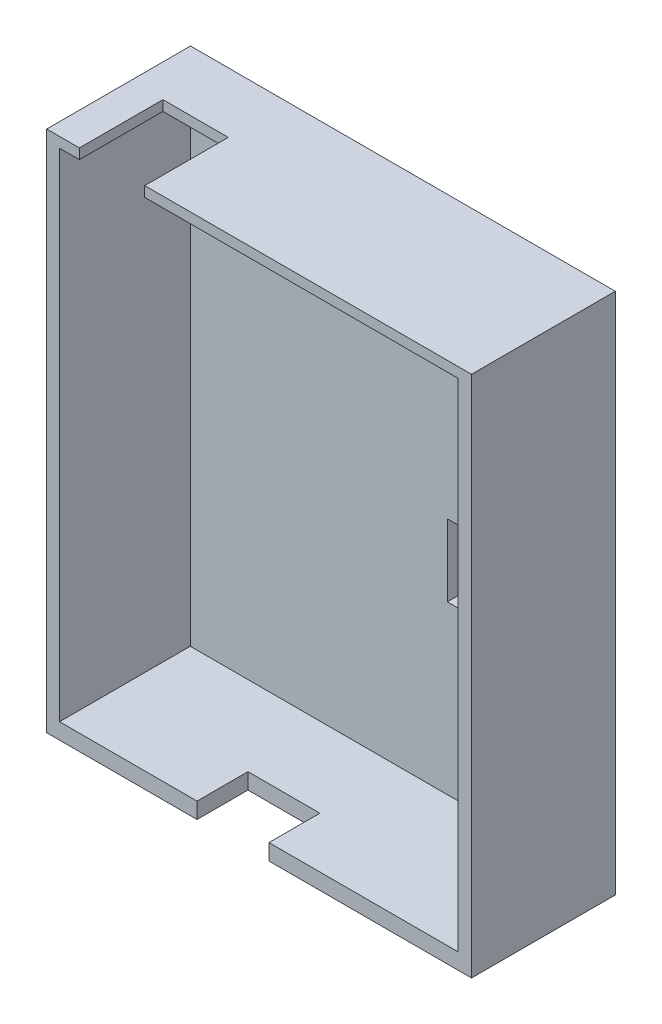
ISO-10303-21;
HEADER;
FILE_DESCRIPTION(('STEP AP214'),'2;1');
FILE_NAME('part.step','',(''),(''),'','','');
FILE_SCHEMA(('AUTOMOTIVE_DESIGN { 1 0 10303 214 1 1 1 1 }'));
ENDSEC;
DATA;
#1=APPLICATION_CONTEXT('core data for automotive mechanical design processes');
#2=APPLICATION_PROTOCOL_DEFINITION('international standard','automotive_design',2000,#1);
#3=PRODUCT_CONTEXT('',#1,'mechanical');
#4=PRODUCT('Part','Part','',(#3));
#5=PRODUCT_RELATED_PRODUCT_CATEGORY('part','',(#4));
#6=PRODUCT_DEFINITION_FORMATION('','',#4);
#7=PRODUCT_DEFINITION_CONTEXT('part definition',#1,'design');
#8=PRODUCT_DEFINITION('design','',#6,#7);
#9=PRODUCT_DEFINITION_SHAPE('','',#8);
#10=(LENGTH_UNIT() NAMED_UNIT(*) SI_UNIT(.MILLI.,.METRE.));
#11=(NAMED_UNIT(*) PLANE_ANGLE_UNIT() SI_UNIT($,.RADIAN.));
#12=(NAMED_UNIT(*) SI_UNIT($,.STERADIAN.) SOLID_ANGLE_UNIT());
#13=UNCERTAINTY_MEASURE_WITH_UNIT(LENGTH_MEASURE(1.E-05),#10,'distance_accuracy_value','');
#14=(GEOMETRIC_REPRESENTATION_CONTEXT(3) GLOBAL_UNCERTAINTY_ASSIGNED_CONTEXT((#13)) GLOBAL_UNIT_ASSIGNED_CONTEXT((#10,
#11,#12)) REPRESENTATION_CONTEXT('',''));
#15=CARTESIAN_POINT('',(0.,0.,0.));
#16=DIRECTION('',(0.,0.,1.));
#17=DIRECTION('',(1.,0.,0.));
#18=AXIS2_PLACEMENT_3D('',#15,#16,#17);
#19=CARTESIAN_POINT('',(0.,0.,22.));
#20=DIRECTION('',(0.,0.,1.));
#21=DIRECTION('',(1.,0.,0.));
#22=AXIS2_PLACEMENT_3D('',#19,#20,#21);
#23=PLANE('',#22);
#24=DIRECTION('',(0.,-1.,0.));
#25=VECTOR('',#24,1.);
#26=CARTESIAN_POINT('',(-19.2279657980381,0.,22.));
#27=LINE('',#26,#25);
#28=CARTESIAN_POINT('',(-19.2279657980381,48.8821138211382,22.));
#29=VERTEX_POINT('',#28);
#30=CARTESIAN_POINT('',(-19.2279657980381,47.3249881784567,22.));
#31=VERTEX_POINT('',#30);
#32=EDGE_CURVE('E211',#29,#31,#27,.T.);
#33=ORIENTED_EDGE('',*,*,#32,.F.);
#34=DIRECTION('',(-1.,0.,0.));
#35=VECTOR('',#34,1.);
#36=CARTESIAN_POINT('',(40.7704575376304,48.8821138211382,22.));
#37=LINE('',#36,#35);
#38=CARTESIAN_POINT('',(-24.2295424623696,48.8821138211382,22.));
#39=VERTEX_POINT('',#38);
#40=EDGE_CURVE('E302',#29,#39,#37,.T.);
#41=ORIENTED_EDGE('',*,*,#40,.T.);
#42=DIRECTION('',(0.,-1.,0.));
#43=VECTOR('',#42,1.);
#44=CARTESIAN_POINT('',(-24.2295424623696,48.8821138211382,22.));
#45=LINE('',#44,#43);
#46=CARTESIAN_POINT('',(-24.2295424623695,-31.1178861788618,22.));
#47=VERTEX_POINT('',#46);
#48=EDGE_CURVE('E301',#39,#47,#45,.T.);
#49=ORIENTED_EDGE('',*,*,#48,.T.);
#50=DIRECTION('',(1.,0.,0.));
#51=VECTOR('',#50,1.);
#52=CARTESIAN_POINT('',(-24.2295424623695,-31.1178861788618,22.));
#53=LINE('',#52,#51);
#54=CARTESIAN_POINT('',(-1.2306422306366,-31.1178861788618,22.));
#55=VERTEX_POINT('',#54);
#56=EDGE_CURVE('E305',#47,#55,#53,.T.);
#57=ORIENTED_EDGE('',*,*,#56,.T.);
#58=DIRECTION('',(0.,-1.,0.));
#59=VECTOR('',#58,1.);
#60=CARTESIAN_POINT('',(-1.2306422306366,0.,22.));
#61=LINE('',#60,#59);
#62=CARTESIAN_POINT('',(-1.23064223063661,-28.6750118215433,22.));
#63=VERTEX_POINT('',#62);
#64=EDGE_CURVE('E256',#63,#55,#61,.T.);
#65=ORIENTED_EDGE('',*,*,#64,.F.);
#66=DIRECTION('',(1.,0.,0.));
#67=VECTOR('',#66,1.);
#68=CARTESIAN_POINT('',(38.7351972370817,-28.6750118215433,22.));
#69=LINE('',#68,#67);
#70=CARTESIAN_POINT('',(-22.2648027629183,-28.6750118215433,22.));
#71=VERTEX_POINT('',#70);
#72=EDGE_CURVE('E279',#71,#63,#69,.T.);
#73=ORIENTED_EDGE('',*,*,#72,.F.);
#74=DIRECTION('',(0.,-1.,0.));
#75=VECTOR('',#74,1.);
#76=CARTESIAN_POINT('',(-22.2648027629183,-28.6750118215433,22.));
#77=LINE('',#76,#75);
#78=CARTESIAN_POINT('',(-22.2648027629183,47.3249881784567,22.));
#79=VERTEX_POINT('',#78);
#80=EDGE_CURVE('E261',#79,#71,#77,.T.);
#81=ORIENTED_EDGE('',*,*,#80,.F.);
#82=DIRECTION('',(-1.,0.,0.));
#83=VECTOR('',#82,1.);
#84=CARTESIAN_POINT('',(-22.2648027629183,47.3249881784567,22.));
#85=LINE('',#84,#83);
#86=EDGE_CURVE('E285',#31,#79,#85,.T.);
#87=ORIENTED_EDGE('',*,*,#86,.F.);
#88=EDGE_LOOP('',(#33,#41,#49,#57,#65,#73,#81,#87));
#89=FACE_BOUND('',#88,.T.);
#90=ADVANCED_FACE('F38',(#89),#23,.T.);
#91=CARTESIAN_POINT('',(40.7704575376304,48.8821138211382,22.));
#92=DIRECTION('',(0.,-1.,0.));
#93=DIRECTION('',(0.,0.,-1.));
#94=AXIS2_PLACEMENT_3D('',#91,#92,#93);
#95=PLANE('',#94);
#96=ORIENTED_EDGE('',*,*,#40,.F.);
#97=DIRECTION('',(0.,0.,1.));
#98=VECTOR('',#97,1.);
#99=CARTESIAN_POINT('',(-19.2279657980381,48.8821138211382,23.2177580308033));
#100=LINE('',#99,#98);
#101=CARTESIAN_POINT('',(-19.2279657980381,48.8821138211382,9.21775803080327));
#102=VERTEX_POINT('',#101);
#103=EDGE_CURVE('E203',#102,#29,#100,.T.);
#104=ORIENTED_EDGE('',*,*,#103,.F.);
#105=DIRECTION('',(-1.,0.,0.));
#106=VECTOR('',#105,1.);
#107=CARTESIAN_POINT('',(-19.2279657980381,48.8821138211382,9.21775803080327));
#108=LINE('',#107,#106);
#109=CARTESIAN_POINT('',(-9.22796579803812,48.8821138211382,9.21775803080327));
#110=VERTEX_POINT('',#109);
#111=EDGE_CURVE('E189',#110,#102,#108,.T.);
#112=ORIENTED_EDGE('',*,*,#111,.F.);
#113=DIRECTION('',(0.,0.,-1.));
#114=VECTOR('',#113,1.);
#115=CARTESIAN_POINT('',(-9.22796579803812,48.8821138211382,9.21775803080327));
#116=LINE('',#115,#114);
#117=CARTESIAN_POINT('',(-9.22796579803812,48.8821138211382,22.));
#118=VERTEX_POINT('',#117);
#119=EDGE_CURVE('E196',#118,#110,#116,.T.);
#120=ORIENTED_EDGE('',*,*,#119,.F.);
#121=CARTESIAN_POINT('',(40.7704575376304,48.8821138211382,22.));
#122=VERTEX_POINT('',#121);
#123=EDGE_CURVE('E299',#122,#118,#37,.T.);
#124=ORIENTED_EDGE('',*,*,#123,.F.);
#125=DIRECTION('',(0.,0.,-1.));
#126=VECTOR('',#125,1.);
#127=CARTESIAN_POINT('',(40.7704575376304,48.8821138211382,22.));
#128=LINE('',#127,#126);
#129=CARTESIAN_POINT('',(40.7704575376304,48.8821138211382,0.));
#130=VERTEX_POINT('',#129);
#131=EDGE_CURVE('E310',#122,#130,#128,.T.);
#132=ORIENTED_EDGE('',*,*,#131,.T.);
#133=DIRECTION('',(-1.,0.,0.));
#134=VECTOR('',#133,1.);
#135=CARTESIAN_POINT('',(40.7704575376304,48.8821138211382,0.));
#136=LINE('',#135,#134);
#137=CARTESIAN_POINT('',(-24.2295424623696,48.8821138211382,0.));
#138=VERTEX_POINT('',#137);
#139=EDGE_CURVE('E291',#130,#138,#136,.T.);
#140=ORIENTED_EDGE('',*,*,#139,.T.);
#141=DIRECTION('',(0.,0.,-1.));
#142=VECTOR('',#141,1.);
#143=CARTESIAN_POINT('',(-24.2295424623696,48.8821138211382,22.));
#144=LINE('',#143,#142);
#145=EDGE_CURVE('E327',#39,#138,#144,.T.);
#146=ORIENTED_EDGE('',*,*,#145,.F.);
#147=EDGE_LOOP('',(#96,#104,#112,#120,#124,#132,#140,#146));
#148=FACE_BOUND('',#147,.T.);
#149=ADVANCED_FACE('F40',(#148),#95,.F.);
#150=CARTESIAN_POINT('',(-24.2295424623696,48.8821138211382,22.));
#151=DIRECTION('',(1.,0.,0.));
#152=DIRECTION('',(0.,1.,0.));
#153=AXIS2_PLACEMENT_3D('',#150,#151,#152);
#154=PLANE('',#153);
#155=DIRECTION('',(0.,-1.,0.));
#156=VECTOR('',#155,1.);
#157=CARTESIAN_POINT('',(-24.2295424623696,48.8821138211382,0.));
#158=LINE('',#157,#156);
#159=CARTESIAN_POINT('',(-24.2295424623695,-31.1178861788618,0.));
#160=VERTEX_POINT('',#159);
#161=EDGE_CURVE('E313',#138,#160,#158,.T.);
#162=ORIENTED_EDGE('',*,*,#161,.T.);
#163=DIRECTION('',(0.,0.,-1.));
#164=VECTOR('',#163,1.);
#165=CARTESIAN_POINT('',(-24.2295424623695,-31.1178861788618,22.));
#166=LINE('',#165,#164);
#167=EDGE_CURVE('E324',#47,#160,#166,.T.);
#168=ORIENTED_EDGE('',*,*,#167,.F.);
#169=ORIENTED_EDGE('',*,*,#48,.F.);
#170=ORIENTED_EDGE('',*,*,#145,.T.);
#171=EDGE_LOOP('',(#162,#168,#169,#170));
#172=FACE_BOUND('',#171,.T.);
#173=ADVANCED_FACE('F371',(#172),#154,.F.);
#174=CARTESIAN_POINT('',(-24.2295424623695,-31.1178861788618,22.));
#175=DIRECTION('',(0.,1.,0.));
#176=DIRECTION('',(0.,0.,1.));
#177=AXIS2_PLACEMENT_3D('',#174,#175,#176);
#178=PLANE('',#177);
#179=CARTESIAN_POINT('',(9.76935776936339,-31.1178861788618,22.));
#180=VERTEX_POINT('',#179);
#181=CARTESIAN_POINT('',(40.7704575376304,-31.1178861788618,22.));
#182=VERTEX_POINT('',#181);
#183=EDGE_CURVE('E304',#180,#182,#53,.T.);
#184=ORIENTED_EDGE('',*,*,#183,.F.);
#185=DIRECTION('',(0.,0.,1.));
#186=VECTOR('',#185,1.);
#187=CARTESIAN_POINT('',(9.76935776936339,-31.1178861788618,22.7048923409227));
#188=LINE('',#187,#186);
#189=CARTESIAN_POINT('',(9.76935776936339,-31.1178861788618,14.2048923409227));
#190=VERTEX_POINT('',#189);
#191=EDGE_CURVE('E245',#190,#180,#188,.T.);
#192=ORIENTED_EDGE('',*,*,#191,.F.);
#193=DIRECTION('',(1.,0.,0.));
#194=VECTOR('',#193,1.);
#195=CARTESIAN_POINT('',(9.76935776936339,-31.1178861788618,14.2048923409227));
#196=LINE('',#195,#194);
#197=CARTESIAN_POINT('',(-1.23064223063659,-31.1178861788618,14.2048923409227));
#198=VERTEX_POINT('',#197);
#199=EDGE_CURVE('E250',#198,#190,#196,.T.);
#200=ORIENTED_EDGE('',*,*,#199,.F.);
#201=DIRECTION('',(0.,0.,-1.));
#202=VECTOR('',#201,1.);
#203=CARTESIAN_POINT('',(-1.23064223063659,-31.1178861788618,14.2048923409227));
#204=LINE('',#203,#202);
#205=EDGE_CURVE('E247',#55,#198,#204,.T.);
#206=ORIENTED_EDGE('',*,*,#205,.F.);
#207=ORIENTED_EDGE('',*,*,#56,.F.);
#208=ORIENTED_EDGE('',*,*,#167,.T.);
#209=DIRECTION('',(1.,0.,0.));
#210=VECTOR('',#209,1.);
#211=CARTESIAN_POINT('',(-24.2295424623695,-31.1178861788618,0.));
#212=LINE('',#211,#210);
#213=CARTESIAN_POINT('',(40.7704575376304,-31.1178861788618,0.));
#214=VERTEX_POINT('',#213);
#215=EDGE_CURVE('E315',#160,#214,#212,.T.);
#216=ORIENTED_EDGE('',*,*,#215,.T.);
#217=DIRECTION('',(0.,0.,-1.));
#218=VECTOR('',#217,1.);
#219=CARTESIAN_POINT('',(40.7704575376304,-31.1178861788618,22.));
#220=LINE('',#219,#218);
#221=EDGE_CURVE('E321',#182,#214,#220,.T.);
#222=ORIENTED_EDGE('',*,*,#221,.F.);
#223=EDGE_LOOP('',(#184,#192,#200,#206,#207,#208,#216,#222));
#224=FACE_BOUND('',#223,.T.);
#225=ADVANCED_FACE('F404',(#224),#178,.F.);
#226=CARTESIAN_POINT('',(40.7704575376304,-31.1178861788618,22.));
#227=DIRECTION('',(-1.,0.,0.));
#228=DIRECTION('',(0.,-1.,0.));
#229=AXIS2_PLACEMENT_3D('',#226,#227,#228);
#230=PLANE('',#229);
#231=DIRECTION('',(0.,1.,0.));
#232=VECTOR('',#231,1.);
#233=CARTESIAN_POINT('',(40.7704575376304,-31.1178861788618,0.));
#234=LINE('',#233,#232);
#235=EDGE_CURVE('E317',#214,#130,#234,.T.);
#236=ORIENTED_EDGE('',*,*,#235,.T.);
#237=ORIENTED_EDGE('',*,*,#131,.F.);
#238=DIRECTION('',(0.,1.,0.));
#239=VECTOR('',#238,1.);
#240=CARTESIAN_POINT('',(40.7704575376304,-31.1178861788618,22.));
#241=LINE('',#240,#239);
#242=EDGE_CURVE('E308',#182,#122,#241,.T.);
#243=ORIENTED_EDGE('',*,*,#242,.F.);
#244=ORIENTED_EDGE('',*,*,#221,.T.);
#245=EDGE_LOOP('',(#236,#237,#243,#244));
#246=FACE_BOUND('',#245,.T.);
#247=ADVANCED_FACE('F396',(#246),#230,.F.);
#248=DIRECTION('',(0.,1.,0.));
#249=VECTOR('',#248,1.);
#250=CARTESIAN_POINT('',(-9.22796579803812,0.,22.));
#251=LINE('',#250,#249);
#252=CARTESIAN_POINT('',(-9.22796579803812,47.3249881784567,22.));
#253=VERTEX_POINT('',#252);
#254=EDGE_CURVE('E199',#253,#118,#251,.T.);
#255=ORIENTED_EDGE('',*,*,#254,.F.);
#256=CARTESIAN_POINT('',(38.7351972370817,47.3249881784567,22.));
#257=VERTEX_POINT('',#256);
#258=EDGE_CURVE('E266',#257,#253,#85,.T.);
#259=ORIENTED_EDGE('',*,*,#258,.F.);
#260=DIRECTION('',(0.,1.,0.));
#261=VECTOR('',#260,1.);
#262=CARTESIAN_POINT('',(38.7351972370817,47.3249881784567,22.));
#263=LINE('',#262,#261);
#264=CARTESIAN_POINT('',(38.7351972370817,-28.6750118215433,22.));
#265=VERTEX_POINT('',#264);
#266=EDGE_CURVE('E282',#265,#257,#263,.T.);
#267=ORIENTED_EDGE('',*,*,#266,.F.);
#268=CARTESIAN_POINT('',(9.76935776936339,-28.6750118215433,22.));
#269=VERTEX_POINT('',#268);
#270=EDGE_CURVE('E278',#269,#265,#69,.T.);
#271=ORIENTED_EDGE('',*,*,#270,.F.);
#272=DIRECTION('',(0.,1.,0.));
#273=VECTOR('',#272,1.);
#274=CARTESIAN_POINT('',(9.76935776936339,0.,22.));
#275=LINE('',#274,#273);
#276=EDGE_CURVE('E259',#180,#269,#275,.T.);
#277=ORIENTED_EDGE('',*,*,#276,.F.);
#278=ORIENTED_EDGE('',*,*,#183,.T.);
#279=ORIENTED_EDGE('',*,*,#242,.T.);
#280=ORIENTED_EDGE('',*,*,#123,.T.);
#281=EDGE_LOOP('',(#255,#259,#267,#271,#277,#278,#279,#280));
#282=FACE_BOUND('',#281,.T.);
#283=ADVANCED_FACE('F357',(#282),#23,.T.);
#284=CARTESIAN_POINT('',(0.,0.,0.));
#285=DIRECTION('',(0.,0.,1.));
#286=DIRECTION('',(1.,0.,0.));
#287=AXIS2_PLACEMENT_3D('',#284,#285,#286);
#288=PLANE('',#287);
#289=DIRECTION('',(-1.,0.,0.));
#290=VECTOR('',#289,1.);
#291=CARTESIAN_POINT('',(17.073968875299,-3.12058119178454,0.));
#292=LINE('',#291,#290);
#293=CARTESIAN_POINT('',(40.073968875299,-3.12058119178454,0.));
#294=VERTEX_POINT('',#293);
#295=CARTESIAN_POINT('',(17.073968875299,-3.12058119178454,0.));
#296=VERTEX_POINT('',#295);
#297=EDGE_CURVE('E224',#294,#296,#292,.T.);
#298=ORIENTED_EDGE('',*,*,#297,.F.);
#299=DIRECTION('',(0.,-1.,0.));
#300=VECTOR('',#299,1.);
#301=CARTESIAN_POINT('',(40.073968875299,-3.12058119178454,0.));
#302=LINE('',#301,#300);
#303=CARTESIAN_POINT('',(40.073968875299,7.87941880821546,0.));
#304=VERTEX_POINT('',#303);
#305=EDGE_CURVE('E61',#304,#294,#302,.T.);
#306=ORIENTED_EDGE('',*,*,#305,.F.);
#307=DIRECTION('',(1.,0.,0.));
#308=VECTOR('',#307,1.);
#309=CARTESIAN_POINT('',(40.073968875299,7.87941880821546,0.));
#310=LINE('',#309,#308);
#311=CARTESIAN_POINT('',(17.073968875299,7.87941880821546,0.));
#312=VERTEX_POINT('',#311);
#313=EDGE_CURVE('E217',#312,#304,#310,.T.);
#314=ORIENTED_EDGE('',*,*,#313,.F.);
#315=DIRECTION('',(0.,1.,0.));
#316=VECTOR('',#315,1.);
#317=CARTESIAN_POINT('',(17.073968875299,7.87941880821546,0.));
#318=LINE('',#317,#316);
#319=EDGE_CURVE('E227',#296,#312,#318,.T.);
#320=ORIENTED_EDGE('',*,*,#319,.F.);
#321=EDGE_LOOP('',(#298,#306,#314,#320));
#322=FACE_BOUND('',#321,.T.);
#323=ORIENTED_EDGE('',*,*,#139,.F.);
#324=ORIENTED_EDGE('',*,*,#235,.F.);
#325=ORIENTED_EDGE('',*,*,#215,.F.);
#326=ORIENTED_EDGE('',*,*,#161,.F.);
#327=EDGE_LOOP('',(#323,#324,#325,#326));
#328=FACE_BOUND('',#327,.T.);
#329=ADVANCED_FACE('F366',(#322,#328),#288,.F.);
#330=CARTESIAN_POINT('',(-22.2648027629183,-28.6750118215433,2.));
#331=DIRECTION('',(-1.,0.,0.));
#332=DIRECTION('',(0.,0.,1.));
#333=AXIS2_PLACEMENT_3D('',#330,#331,#332);
#334=PLANE('',#333);
#335=ORIENTED_EDGE('',*,*,#80,.T.);
#336=DIRECTION('',(0.,0.,1.));
#337=VECTOR('',#336,1.);
#338=CARTESIAN_POINT('',(-22.2648027629183,-28.6750118215433,2.));
#339=LINE('',#338,#337);
#340=CARTESIAN_POINT('',(-22.2648027629183,-28.6750118215433,2.));
#341=VERTEX_POINT('',#340);
#342=EDGE_CURVE('E276',#341,#71,#339,.T.);
#343=ORIENTED_EDGE('',*,*,#342,.F.);
#344=DIRECTION('',(0.,-1.,0.));
#345=VECTOR('',#344,1.);
#346=CARTESIAN_POINT('',(-22.2648027629183,-28.6750118215433,2.));
#347=LINE('',#346,#345);
#348=CARTESIAN_POINT('',(-22.2648027629183,47.3249881784567,2.));
#349=VERTEX_POINT('',#348);
#350=EDGE_CURVE('E262',#349,#341,#347,.T.);
#351=ORIENTED_EDGE('',*,*,#350,.F.);
#352=DIRECTION('',(0.,0.,1.));
#353=VECTOR('',#352,1.);
#354=CARTESIAN_POINT('',(-22.2648027629183,47.3249881784567,2.));
#355=LINE('',#354,#353);
#356=EDGE_CURVE('E288',#349,#79,#355,.T.);
#357=ORIENTED_EDGE('',*,*,#356,.T.);
#358=EDGE_LOOP('',(#335,#343,#351,#357));
#359=FACE_BOUND('',#358,.T.);
#360=ADVANCED_FACE('F401',(#359),#334,.F.);
#361=CARTESIAN_POINT('',(-22.2648027629183,47.3249881784567,2.));
#362=DIRECTION('',(0.,1.,0.));
#363=DIRECTION('',(-1.,0.,0.));
#364=AXIS2_PLACEMENT_3D('',#361,#362,#363);
#365=PLANE('',#364);
#366=DIRECTION('',(-1.,0.,0.));
#367=VECTOR('',#366,1.);
#368=CARTESIAN_POINT('',(-22.2648027629183,47.3249881784567,9.21775803080327));
#369=LINE('',#368,#367);
#370=CARTESIAN_POINT('',(-9.22796579803812,47.3249881784567,9.21775803080327));
#371=VERTEX_POINT('',#370);
#372=CARTESIAN_POINT('',(-19.2279657980381,47.3249881784567,9.21775803080327));
#373=VERTEX_POINT('',#372);
#374=EDGE_CURVE('E46',#371,#373,#369,.T.);
#375=ORIENTED_EDGE('',*,*,#374,.T.);
#376=DIRECTION('',(0.,0.,1.));
#377=VECTOR('',#376,1.);
#378=CARTESIAN_POINT('',(-19.2279657980381,47.3249881784567,2.));
#379=LINE('',#378,#377);
#380=EDGE_CURVE('E11',#373,#31,#379,.T.);
#381=ORIENTED_EDGE('',*,*,#380,.T.);
#382=ORIENTED_EDGE('',*,*,#86,.T.);
#383=ORIENTED_EDGE('',*,*,#356,.F.);
#384=DIRECTION('',(-1.,0.,0.));
#385=VECTOR('',#384,1.);
#386=CARTESIAN_POINT('',(-22.2648027629183,47.3249881784567,2.));
#387=LINE('',#386,#385);
#388=CARTESIAN_POINT('',(38.7351972370817,47.3249881784567,2.));
#389=VERTEX_POINT('',#388);
#390=EDGE_CURVE('E273',#389,#349,#387,.T.);
#391=ORIENTED_EDGE('',*,*,#390,.F.);
#392=DIRECTION('',(0.,0.,1.));
#393=VECTOR('',#392,1.);
#394=CARTESIAN_POINT('',(38.7351972370817,47.3249881784567,2.));
#395=LINE('',#394,#393);
#396=EDGE_CURVE('E292',#389,#257,#395,.T.);
#397=ORIENTED_EDGE('',*,*,#396,.T.);
#398=ORIENTED_EDGE('',*,*,#258,.T.);
#399=DIRECTION('',(0.,0.,-1.));
#400=VECTOR('',#399,1.);
#401=CARTESIAN_POINT('',(-9.22796579803812,47.3249881784567,2.));
#402=LINE('',#401,#400);
#403=EDGE_CURVE('E351',#253,#371,#402,.T.);
#404=ORIENTED_EDGE('',*,*,#403,.T.);
#405=EDGE_LOOP('',(#375,#381,#382,#383,#391,#397,#398,#404));
#406=FACE_BOUND('',#405,.T.);
#407=ADVANCED_FACE('F353',(#406),#365,.F.);
#408=CARTESIAN_POINT('',(38.7351972370817,47.3249881784567,2.));
#409=DIRECTION('',(1.,0.,0.));
#410=DIRECTION('',(0.,1.,0.));
#411=AXIS2_PLACEMENT_3D('',#408,#409,#410);
#412=PLANE('',#411);
#413=DIRECTION('',(0.,1.,0.));
#414=VECTOR('',#413,1.);
#415=CARTESIAN_POINT('',(38.7351972370817,47.3249881784567,2.));
#416=LINE('',#415,#414);
#417=CARTESIAN_POINT('',(38.7351972370817,7.87941880821546,2.));
#418=VERTEX_POINT('',#417);
#419=EDGE_CURVE('E269',#418,#389,#416,.T.);
#420=ORIENTED_EDGE('',*,*,#419,.F.);
#421=DIRECTION('',(0.,0.,1.));
#422=VECTOR('',#421,1.);
#423=CARTESIAN_POINT('',(38.7351972370817,7.87941880821545,2.));
#424=LINE('',#423,#422);
#425=CARTESIAN_POINT('',(38.7351972370817,7.87941880821546,3.));
#426=VERTEX_POINT('',#425);
#427=EDGE_CURVE('E242',#418,#426,#424,.T.);
#428=ORIENTED_EDGE('',*,*,#427,.T.);
#429=DIRECTION('',(0.,-1.,0.));
#430=VECTOR('',#429,1.);
#431=CARTESIAN_POINT('',(38.7351972370817,47.3249881784567,3.));
#432=LINE('',#431,#430);
#433=CARTESIAN_POINT('',(38.7351972370817,-3.12058119178454,3.));
#434=VERTEX_POINT('',#433);
#435=EDGE_CURVE('E348',#426,#434,#432,.T.);
#436=ORIENTED_EDGE('',*,*,#435,.T.);
#437=DIRECTION('',(0.,0.,-1.));
#438=VECTOR('',#437,1.);
#439=CARTESIAN_POINT('',(38.7351972370817,-3.12058119178454,2.));
#440=LINE('',#439,#438);
#441=CARTESIAN_POINT('',(38.7351972370817,-3.12058119178454,2.));
#442=VERTEX_POINT('',#441);
#443=EDGE_CURVE('E234',#434,#442,#440,.T.);
#444=ORIENTED_EDGE('',*,*,#443,.T.);
#445=CARTESIAN_POINT('',(38.7351972370817,-28.6750118215433,2.));
#446=VERTEX_POINT('',#445);
#447=EDGE_CURVE('E270',#446,#442,#416,.T.);
#448=ORIENTED_EDGE('',*,*,#447,.F.);
#449=DIRECTION('',(0.,0.,1.));
#450=VECTOR('',#449,1.);
#451=CARTESIAN_POINT('',(38.7351972370817,-28.6750118215433,2.));
#452=LINE('',#451,#450);
#453=EDGE_CURVE('E294',#446,#265,#452,.T.);
#454=ORIENTED_EDGE('',*,*,#453,.T.);
#455=ORIENTED_EDGE('',*,*,#266,.T.);
#456=ORIENTED_EDGE('',*,*,#396,.F.);
#457=EDGE_LOOP('',(#420,#428,#436,#444,#448,#454,#455,#456));
#458=FACE_BOUND('',#457,.T.);
#459=ADVANCED_FACE('F437',(#458),#412,.F.);
#460=CARTESIAN_POINT('',(38.7351972370817,-28.6750118215433,2.));
#461=DIRECTION('',(0.,-1.,0.));
#462=DIRECTION('',(1.,0.,0.));
#463=AXIS2_PLACEMENT_3D('',#460,#461,#462);
#464=PLANE('',#463);
#465=DIRECTION('',(1.,0.,0.));
#466=VECTOR('',#465,1.);
#467=CARTESIAN_POINT('',(38.7351972370817,-28.6750118215433,14.2048923409227));
#468=LINE('',#467,#466);
#469=CARTESIAN_POINT('',(-1.2306422306366,-28.6750118215433,14.2048923409227));
#470=VERTEX_POINT('',#469);
#471=CARTESIAN_POINT('',(9.76935776936339,-28.6750118215433,14.2048923409227));
#472=VERTEX_POINT('',#471);
#473=EDGE_CURVE('E333',#470,#472,#468,.T.);
#474=ORIENTED_EDGE('',*,*,#473,.T.);
#475=DIRECTION('',(0.,0.,1.));
#476=VECTOR('',#475,1.);
#477=CARTESIAN_POINT('',(9.76935776936339,-28.6750118215433,2.));
#478=LINE('',#477,#476);
#479=EDGE_CURVE('E336',#472,#269,#478,.T.);
#480=ORIENTED_EDGE('',*,*,#479,.T.);
#481=ORIENTED_EDGE('',*,*,#270,.T.);
#482=ORIENTED_EDGE('',*,*,#453,.F.);
#483=DIRECTION('',(1.,0.,0.));
#484=VECTOR('',#483,1.);
#485=CARTESIAN_POINT('',(38.7351972370817,-28.6750118215433,2.));
#486=LINE('',#485,#484);
#487=EDGE_CURVE('E265',#341,#446,#486,.T.);
#488=ORIENTED_EDGE('',*,*,#487,.F.);
#489=ORIENTED_EDGE('',*,*,#342,.T.);
#490=ORIENTED_EDGE('',*,*,#72,.T.);
#491=DIRECTION('',(0.,0.,-1.));
#492=VECTOR('',#491,1.);
#493=CARTESIAN_POINT('',(-1.23064223063659,-28.6750118215433,1.99999999999997));
#494=LINE('',#493,#492);
#495=EDGE_CURVE('E330',#63,#470,#494,.T.);
#496=ORIENTED_EDGE('',*,*,#495,.T.);
#497=EDGE_LOOP('',(#474,#480,#481,#482,#488,#489,#490,#496));
#498=FACE_BOUND('',#497,.T.);
#499=ADVANCED_FACE('F431',(#498),#464,.F.);
#500=CARTESIAN_POINT('',(0.,0.,2.));
#501=DIRECTION('',(0.,0.,-1.));
#502=DIRECTION('',(-1.,0.,0.));
#503=AXIS2_PLACEMENT_3D('',#500,#501,#502);
#504=PLANE('',#503);
#505=DIRECTION('',(0.,1.,0.));
#506=VECTOR('',#505,1.);
#507=CARTESIAN_POINT('',(17.073968875299,0.,2.));
#508=LINE('',#507,#506);
#509=CARTESIAN_POINT('',(17.073968875299,-3.12058119178454,2.));
#510=VERTEX_POINT('',#509);
#511=CARTESIAN_POINT('',(17.073968875299,7.87941880821546,2.));
#512=VERTEX_POINT('',#511);
#513=EDGE_CURVE('E342',#510,#512,#508,.T.);
#514=ORIENTED_EDGE('',*,*,#513,.T.);
#515=DIRECTION('',(1.,0.,0.));
#516=VECTOR('',#515,1.);
#517=CARTESIAN_POINT('',(0.,7.87941880821546,2.));
#518=LINE('',#517,#516);
#519=EDGE_CURVE('E345',#512,#418,#518,.T.);
#520=ORIENTED_EDGE('',*,*,#519,.T.);
#521=ORIENTED_EDGE('',*,*,#419,.T.);
#522=ORIENTED_EDGE('',*,*,#390,.T.);
#523=ORIENTED_EDGE('',*,*,#350,.T.);
#524=ORIENTED_EDGE('',*,*,#487,.T.);
#525=ORIENTED_EDGE('',*,*,#447,.T.);
#526=DIRECTION('',(-1.,0.,0.));
#527=VECTOR('',#526,1.);
#528=CARTESIAN_POINT('',(0.,-3.12058119178454,2.));
#529=LINE('',#528,#527);
#530=EDGE_CURVE('E339',#442,#510,#529,.T.);
#531=ORIENTED_EDGE('',*,*,#530,.T.);
#532=EDGE_LOOP('',(#514,#520,#521,#522,#523,#524,#525,#531));
#533=FACE_BOUND('',#532,.T.);
#534=ADVANCED_FACE('F436',(#533),#504,.F.);
#535=CARTESIAN_POINT('',(9.76935776936339,-28.1178861788618,14.2048923409227));
#536=DIRECTION('',(0.,0.,-1.));
#537=DIRECTION('',(-1.,0.,0.));
#538=AXIS2_PLACEMENT_3D('',#535,#536,#537);
#539=PLANE('',#538);
#540=DIRECTION('',(0.,-1.,0.));
#541=VECTOR('',#540,1.);
#542=CARTESIAN_POINT('',(-1.23064223063659,-28.1178861788618,14.2048923409227));
#543=LINE('',#542,#541);
#544=EDGE_CURVE('E253',#470,#198,#543,.T.);
#545=ORIENTED_EDGE('',*,*,#544,.T.);
#546=ORIENTED_EDGE('',*,*,#199,.T.);
#547=DIRECTION('',(0.,-1.,0.));
#548=VECTOR('',#547,1.);
#549=CARTESIAN_POINT('',(9.76935776936339,-28.1178861788618,14.2048923409227));
#550=LINE('',#549,#548);
#551=EDGE_CURVE('E254',#472,#190,#550,.T.);
#552=ORIENTED_EDGE('',*,*,#551,.F.);
#553=ORIENTED_EDGE('',*,*,#473,.F.);
#554=EDGE_LOOP('',(#545,#546,#552,#553));
#555=FACE_BOUND('',#554,.T.);
#556=ADVANCED_FACE('F447',(#555),#539,.F.);
#557=CARTESIAN_POINT('',(9.76935776936339,-28.1178861788618,22.7048923409227));
#558=DIRECTION('',(1.,0.,0.));
#559=DIRECTION('',(0.,0.,-1.));
#560=AXIS2_PLACEMENT_3D('',#557,#558,#559);
#561=PLANE('',#560);
#562=ORIENTED_EDGE('',*,*,#276,.T.);
#563=ORIENTED_EDGE('',*,*,#479,.F.);
#564=ORIENTED_EDGE('',*,*,#551,.T.);
#565=ORIENTED_EDGE('',*,*,#191,.T.);
#566=EDGE_LOOP('',(#562,#563,#564,#565));
#567=FACE_BOUND('',#566,.T.);
#568=ADVANCED_FACE('F452',(#567),#561,.F.);
#569=CARTESIAN_POINT('',(-1.23064223063659,-28.1178861788618,14.2048923409227));
#570=DIRECTION('',(-1.,0.,0.));
#571=DIRECTION('',(0.,0.,1.));
#572=AXIS2_PLACEMENT_3D('',#569,#570,#571);
#573=PLANE('',#572);
#574=ORIENTED_EDGE('',*,*,#64,.T.);
#575=ORIENTED_EDGE('',*,*,#205,.T.);
#576=ORIENTED_EDGE('',*,*,#544,.F.);
#577=ORIENTED_EDGE('',*,*,#495,.F.);
#578=EDGE_LOOP('',(#574,#575,#576,#577));
#579=FACE_BOUND('',#578,.T.);
#580=ADVANCED_FACE('F462',(#579),#573,.F.);
#581=CARTESIAN_POINT('',(0.,0.,3.));
#582=DIRECTION('',(0.,0.,1.));
#583=DIRECTION('',(1.,0.,0.));
#584=AXIS2_PLACEMENT_3D('',#581,#582,#583);
#585=PLANE('',#584);
#586=DIRECTION('',(1.,0.,0.));
#587=VECTOR('',#586,1.);
#588=CARTESIAN_POINT('',(40.073968875299,7.87941880821546,3.));
#589=LINE('',#588,#587);
#590=CARTESIAN_POINT('',(40.073968875299,7.87941880821546,3.));
#591=VERTEX_POINT('',#590);
#592=EDGE_CURVE('E220',#426,#591,#589,.T.);
#593=ORIENTED_EDGE('',*,*,#592,.T.);
#594=DIRECTION('',(0.,-1.,0.));
#595=VECTOR('',#594,1.);
#596=CARTESIAN_POINT('',(40.073968875299,-3.12058119178454,3.));
#597=LINE('',#596,#595);
#598=CARTESIAN_POINT('',(40.073968875299,-3.12058119178454,3.));
#599=VERTEX_POINT('',#598);
#600=EDGE_CURVE('E213',#591,#599,#597,.T.);
#601=ORIENTED_EDGE('',*,*,#600,.T.);
#602=DIRECTION('',(-1.,0.,0.));
#603=VECTOR('',#602,1.);
#604=CARTESIAN_POINT('',(17.073968875299,-3.12058119178454,3.));
#605=LINE('',#604,#603);
#606=EDGE_CURVE('E216',#599,#434,#605,.T.);
#607=ORIENTED_EDGE('',*,*,#606,.T.);
#608=ORIENTED_EDGE('',*,*,#435,.F.);
#609=EDGE_LOOP('',(#593,#601,#607,#608));
#610=FACE_BOUND('',#609,.T.);
#611=ADVANCED_FACE('F472',(#610),#585,.F.);
#612=CARTESIAN_POINT('',(40.073968875299,7.87941880821546,3.));
#613=DIRECTION('',(0.,1.,0.));
#614=DIRECTION('',(-1.,0.,0.));
#615=AXIS2_PLACEMENT_3D('',#612,#613,#614);
#616=PLANE('',#615);
#617=ORIENTED_EDGE('',*,*,#519,.F.);
#618=DIRECTION('',(0.,0.,-1.));
#619=VECTOR('',#618,1.);
#620=CARTESIAN_POINT('',(17.073968875299,7.87941880821546,3.));
#621=LINE('',#620,#619);
#622=EDGE_CURVE('E235',#512,#312,#621,.T.);
#623=ORIENTED_EDGE('',*,*,#622,.T.);
#624=ORIENTED_EDGE('',*,*,#313,.T.);
#625=DIRECTION('',(0.,0.,-1.));
#626=VECTOR('',#625,1.);
#627=CARTESIAN_POINT('',(40.073968875299,7.87941880821546,3.));
#628=LINE('',#627,#626);
#629=EDGE_CURVE('E232',#591,#304,#628,.T.);
#630=ORIENTED_EDGE('',*,*,#629,.F.);
#631=ORIENTED_EDGE('',*,*,#592,.F.);
#632=ORIENTED_EDGE('',*,*,#427,.F.);
#633=EDGE_LOOP('',(#617,#623,#624,#630,#631,#632));
#634=FACE_BOUND('',#633,.T.);
#635=ADVANCED_FACE('F505',(#634),#616,.F.);
#636=CARTESIAN_POINT('',(17.073968875299,7.87941880821546,3.));
#637=DIRECTION('',(-1.,0.,0.));
#638=DIRECTION('',(0.,0.,1.));
#639=AXIS2_PLACEMENT_3D('',#636,#637,#638);
#640=PLANE('',#639);
#641=DIRECTION('',(0.,0.,-1.));
#642=VECTOR('',#641,1.);
#643=CARTESIAN_POINT('',(17.073968875299,-3.12058119178454,3.));
#644=LINE('',#643,#642);
#645=EDGE_CURVE('E237',#510,#296,#644,.T.);
#646=ORIENTED_EDGE('',*,*,#645,.T.);
#647=ORIENTED_EDGE('',*,*,#319,.T.);
#648=ORIENTED_EDGE('',*,*,#622,.F.);
#649=ORIENTED_EDGE('',*,*,#513,.F.);
#650=EDGE_LOOP('',(#646,#647,#648,#649));
#651=FACE_BOUND('',#650,.T.);
#652=ADVANCED_FACE('F514',(#651),#640,.F.);
#653=CARTESIAN_POINT('',(17.073968875299,-3.12058119178454,3.));
#654=DIRECTION('',(0.,-1.,0.));
#655=DIRECTION('',(1.,0.,0.));
#656=AXIS2_PLACEMENT_3D('',#653,#654,#655);
#657=PLANE('',#656);
#658=ORIENTED_EDGE('',*,*,#606,.F.);
#659=DIRECTION('',(0.,0.,-1.));
#660=VECTOR('',#659,1.);
#661=CARTESIAN_POINT('',(40.073968875299,-3.12058119178454,3.));
#662=LINE('',#661,#660);
#663=EDGE_CURVE('E222',#599,#294,#662,.T.);
#664=ORIENTED_EDGE('',*,*,#663,.T.);
#665=ORIENTED_EDGE('',*,*,#297,.T.);
#666=ORIENTED_EDGE('',*,*,#645,.F.);
#667=ORIENTED_EDGE('',*,*,#530,.F.);
#668=ORIENTED_EDGE('',*,*,#443,.F.);
#669=EDGE_LOOP('',(#658,#664,#665,#666,#667,#668));
#670=FACE_BOUND('',#669,.T.);
#671=ADVANCED_FACE('F524',(#670),#657,.F.);
#672=CARTESIAN_POINT('',(40.073968875299,-3.12058119178454,3.));
#673=DIRECTION('',(1.,0.,0.));
#674=DIRECTION('',(0.,0.,-1.));
#675=AXIS2_PLACEMENT_3D('',#672,#673,#674);
#676=PLANE('',#675);
#677=ORIENTED_EDGE('',*,*,#305,.T.);
#678=ORIENTED_EDGE('',*,*,#663,.F.);
#679=ORIENTED_EDGE('',*,*,#600,.F.);
#680=ORIENTED_EDGE('',*,*,#629,.T.);
#681=EDGE_LOOP('',(#677,#678,#679,#680));
#682=FACE_BOUND('',#681,.T.);
#683=ADVANCED_FACE('F384',(#682),#676,.F.);
#684=CARTESIAN_POINT('',(-19.2279657980381,45.8821138211382,9.21775803080327));
#685=DIRECTION('',(0.,0.,-1.));
#686=DIRECTION('',(-1.,0.,0.));
#687=AXIS2_PLACEMENT_3D('',#684,#685,#686);
#688=PLANE('',#687);
#689=DIRECTION('',(0.,1.,0.));
#690=VECTOR('',#689,1.);
#691=CARTESIAN_POINT('',(-9.22796579803812,45.8821138211382,9.21775803080327));
#692=LINE('',#691,#690);
#693=EDGE_CURVE('E53',#371,#110,#692,.T.);
#694=ORIENTED_EDGE('',*,*,#693,.T.);
#695=ORIENTED_EDGE('',*,*,#111,.T.);
#696=DIRECTION('',(0.,1.,0.));
#697=VECTOR('',#696,1.);
#698=CARTESIAN_POINT('',(-19.2279657980381,45.8821138211382,9.21775803080327));
#699=LINE('',#698,#697);
#700=EDGE_CURVE('E193',#373,#102,#699,.T.);
#701=ORIENTED_EDGE('',*,*,#700,.F.);
#702=ORIENTED_EDGE('',*,*,#374,.F.);
#703=EDGE_LOOP('',(#694,#695,#701,#702));
#704=FACE_BOUND('',#703,.T.);
#705=ADVANCED_FACE('F186',(#704),#688,.F.);
#706=CARTESIAN_POINT('',(-19.2279657980381,45.8821138211382,23.2177580308033));
#707=DIRECTION('',(-1.,0.,0.));
#708=DIRECTION('',(0.,0.,1.));
#709=AXIS2_PLACEMENT_3D('',#706,#707,#708);
#710=PLANE('',#709);
#711=ORIENTED_EDGE('',*,*,#32,.T.);
#712=ORIENTED_EDGE('',*,*,#380,.F.);
#713=ORIENTED_EDGE('',*,*,#700,.T.);
#714=ORIENTED_EDGE('',*,*,#103,.T.);
#715=EDGE_LOOP('',(#711,#712,#713,#714));
#716=FACE_BOUND('',#715,.T.);
#717=ADVANCED_FACE('F376',(#716),#710,.F.);
#718=CARTESIAN_POINT('',(-9.22796579803812,45.8821138211382,9.21775803080327));
#719=DIRECTION('',(1.,0.,0.));
#720=DIRECTION('',(0.,0.,-1.));
#721=AXIS2_PLACEMENT_3D('',#718,#719,#720);
#722=PLANE('',#721);
#723=ORIENTED_EDGE('',*,*,#254,.T.);
#724=ORIENTED_EDGE('',*,*,#119,.T.);
#725=ORIENTED_EDGE('',*,*,#693,.F.);
#726=ORIENTED_EDGE('',*,*,#403,.F.);
#727=EDGE_LOOP('',(#723,#724,#725,#726));
#728=FACE_BOUND('',#727,.T.);
#729=ADVANCED_FACE('F197',(#728),#722,.F.);
#730=CLOSED_SHELL('',(#90,#149,#173,#225,#247,#283,#329,#360,#407,#459,#499,#534,#556,#568,#580,
#611,#635,#652,#671,#683,#705,#717,#729));
#731=MANIFOLD_SOLID_BREP('B2',#730);
#732=ADVANCED_BREP_SHAPE_REPRESENTATION('',(#18,#731),#14);
#733=SHAPE_DEFINITION_REPRESENTATION(#9,#732);
ENDSEC;
END-ISO-10303-21;
